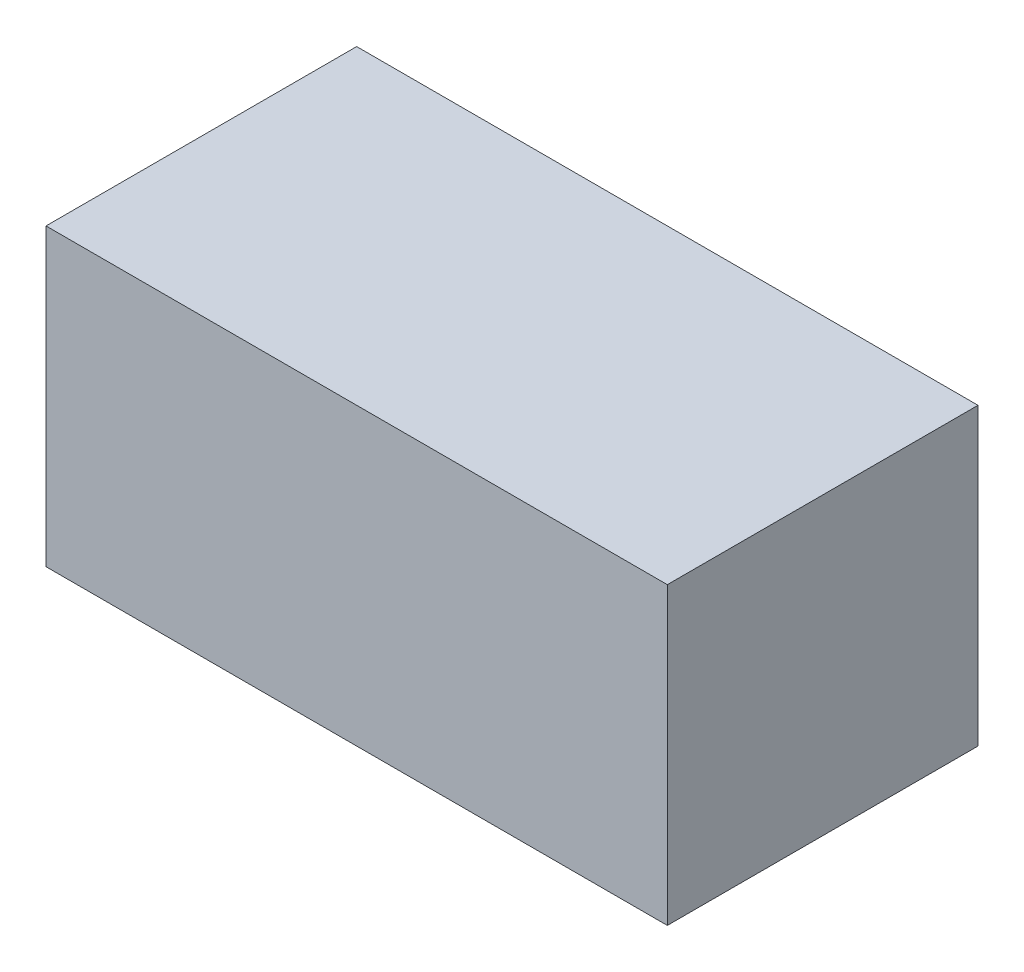
ISO-10303-21;
HEADER;
FILE_DESCRIPTION(('STEP AP214'),'2;1');
FILE_NAME('part.step','',(''),(''),'','','');
FILE_SCHEMA(('AUTOMOTIVE_DESIGN { 1 0 10303 214 1 1 1 1 }'));
ENDSEC;
DATA;
#1=APPLICATION_CONTEXT('core data for automotive mechanical design processes');
#2=APPLICATION_PROTOCOL_DEFINITION('international standard','automotive_design',2000,#1);
#3=PRODUCT_CONTEXT('',#1,'mechanical');
#4=PRODUCT('Part','Part','',(#3));
#5=PRODUCT_RELATED_PRODUCT_CATEGORY('part','',(#4));
#6=PRODUCT_DEFINITION_FORMATION('','',#4);
#7=PRODUCT_DEFINITION_CONTEXT('part definition',#1,'design');
#8=PRODUCT_DEFINITION('design','',#6,#7);
#9=PRODUCT_DEFINITION_SHAPE('','',#8);
#10=(LENGTH_UNIT() NAMED_UNIT(*) SI_UNIT(.MILLI.,.METRE.));
#11=(NAMED_UNIT(*) PLANE_ANGLE_UNIT() SI_UNIT($,.RADIAN.));
#12=(NAMED_UNIT(*) SI_UNIT($,.STERADIAN.) SOLID_ANGLE_UNIT());
#13=UNCERTAINTY_MEASURE_WITH_UNIT(LENGTH_MEASURE(1.E-05),#10,'distance_accuracy_value','');
#14=(GEOMETRIC_REPRESENTATION_CONTEXT(3) GLOBAL_UNCERTAINTY_ASSIGNED_CONTEXT((#13)) GLOBAL_UNIT_ASSIGNED_CONTEXT((#10,
#11,#12)) REPRESENTATION_CONTEXT('',''));
#15=CARTESIAN_POINT('',(0.,0.,0.));
#16=DIRECTION('',(0.,0.,1.));
#17=DIRECTION('',(1.,0.,0.));
#18=AXIS2_PLACEMENT_3D('',#15,#16,#17);
#19=CARTESIAN_POINT('',(0.,19.,0.));
#20=DIRECTION('',(1.,0.,0.));
#21=DIRECTION('',(0.,0.,-1.));
#22=AXIS2_PLACEMENT_3D('',#19,#20,#21);
#23=PLANE('',#22);
#24=DIRECTION('',(0.,0.,1.));
#25=VECTOR('',#24,1.);
#26=CARTESIAN_POINT('',(0.,0.,0.));
#27=LINE('',#26,#25);
#28=CARTESIAN_POINT('',(0.,0.,-20.));
#29=VERTEX_POINT('',#28);
#30=CARTESIAN_POINT('',(0.,0.,0.));
#31=VERTEX_POINT('',#30);
#32=EDGE_CURVE('E105',#29,#31,#27,.T.);
#33=ORIENTED_EDGE('',*,*,#32,.T.);
#34=DIRECTION('',(0.,-1.,0.));
#35=VECTOR('',#34,1.);
#36=CARTESIAN_POINT('',(0.,19.,0.));
#37=LINE('',#36,#35);
#38=CARTESIAN_POINT('',(0.,19.,0.));
#39=VERTEX_POINT('',#38);
#40=EDGE_CURVE('E11',#39,#31,#37,.T.);
#41=ORIENTED_EDGE('',*,*,#40,.F.);
#42=DIRECTION('',(0.,0.,1.));
#43=VECTOR('',#42,1.);
#44=CARTESIAN_POINT('',(0.,19.,0.));
#45=LINE('',#44,#43);
#46=CARTESIAN_POINT('',(0.,19.,-20.));
#47=VERTEX_POINT('',#46);
#48=EDGE_CURVE('E89',#47,#39,#45,.T.);
#49=ORIENTED_EDGE('',*,*,#48,.F.);
#50=DIRECTION('',(0.,-1.,0.));
#51=VECTOR('',#50,1.);
#52=CARTESIAN_POINT('',(0.,19.,-20.));
#53=LINE('',#52,#51);
#54=EDGE_CURVE('E97',#47,#29,#53,.T.);
#55=ORIENTED_EDGE('',*,*,#54,.T.);
#56=EDGE_LOOP('',(#33,#41,#49,#55));
#57=FACE_BOUND('',#56,.T.);
#58=ADVANCED_FACE('F39',(#57),#23,.F.);
#59=CARTESIAN_POINT('',(0.,19.,0.));
#60=DIRECTION('',(0.,0.,-1.));
#61=DIRECTION('',(-1.,0.,0.));
#62=AXIS2_PLACEMENT_3D('',#59,#60,#61);
#63=PLANE('',#62);
#64=DIRECTION('',(1.,0.,0.));
#65=VECTOR('',#64,1.);
#66=CARTESIAN_POINT('',(0.,0.,0.));
#67=LINE('',#66,#65);
#68=CARTESIAN_POINT('',(40.,0.,0.));
#69=VERTEX_POINT('',#68);
#70=EDGE_CURVE('E92',#31,#69,#67,.T.);
#71=ORIENTED_EDGE('',*,*,#70,.T.);
#72=DIRECTION('',(0.,-1.,0.));
#73=VECTOR('',#72,1.);
#74=CARTESIAN_POINT('',(40.,19.,0.));
#75=LINE('',#74,#73);
#76=CARTESIAN_POINT('',(40.,19.,0.));
#77=VERTEX_POINT('',#76);
#78=EDGE_CURVE('E50',#77,#69,#75,.T.);
#79=ORIENTED_EDGE('',*,*,#78,.F.);
#80=DIRECTION('',(1.,0.,0.));
#81=VECTOR('',#80,1.);
#82=CARTESIAN_POINT('',(0.,19.,0.));
#83=LINE('',#82,#81);
#84=EDGE_CURVE('E82',#39,#77,#83,.T.);
#85=ORIENTED_EDGE('',*,*,#84,.F.);
#86=ORIENTED_EDGE('',*,*,#40,.T.);
#87=EDGE_LOOP('',(#71,#79,#85,#86));
#88=FACE_BOUND('',#87,.T.);
#89=ADVANCED_FACE('F93',(#88),#63,.F.);
#90=CARTESIAN_POINT('',(40.,19.,0.));
#91=DIRECTION('',(-1.,0.,0.));
#92=DIRECTION('',(0.,0.,1.));
#93=AXIS2_PLACEMENT_3D('',#90,#91,#92);
#94=PLANE('',#93);
#95=DIRECTION('',(0.,0.,-1.));
#96=VECTOR('',#95,1.);
#97=CARTESIAN_POINT('',(40.,0.,0.));
#98=LINE('',#97,#96);
#99=CARTESIAN_POINT('',(40.,0.,-20.));
#100=VERTEX_POINT('',#99);
#101=EDGE_CURVE('E72',#69,#100,#98,.T.);
#102=ORIENTED_EDGE('',*,*,#101,.T.);
#103=DIRECTION('',(0.,-1.,0.));
#104=VECTOR('',#103,1.);
#105=CARTESIAN_POINT('',(40.,19.,-20.));
#106=LINE('',#105,#104);
#107=CARTESIAN_POINT('',(40.,19.,-20.));
#108=VERTEX_POINT('',#107);
#109=EDGE_CURVE('E94',#108,#100,#106,.T.);
#110=ORIENTED_EDGE('',*,*,#109,.F.);
#111=DIRECTION('',(0.,0.,-1.));
#112=VECTOR('',#111,1.);
#113=CARTESIAN_POINT('',(40.,19.,0.));
#114=LINE('',#113,#112);
#115=EDGE_CURVE('E88',#77,#108,#114,.T.);
#116=ORIENTED_EDGE('',*,*,#115,.F.);
#117=ORIENTED_EDGE('',*,*,#78,.T.);
#118=EDGE_LOOP('',(#102,#110,#116,#117));
#119=FACE_BOUND('',#118,.T.);
#120=ADVANCED_FACE('F96',(#119),#94,.F.);
#121=CARTESIAN_POINT('',(0.,19.,-20.));
#122=DIRECTION('',(0.,0.,1.));
#123=DIRECTION('',(1.,0.,0.));
#124=AXIS2_PLACEMENT_3D('',#121,#122,#123);
#125=PLANE('',#124);
#126=DIRECTION('',(-1.,0.,0.));
#127=VECTOR('',#126,1.);
#128=CARTESIAN_POINT('',(0.,0.,-20.));
#129=LINE('',#128,#127);
#130=EDGE_CURVE('E76',#100,#29,#129,.T.);
#131=ORIENTED_EDGE('',*,*,#130,.T.);
#132=ORIENTED_EDGE('',*,*,#54,.F.);
#133=DIRECTION('',(-1.,0.,0.));
#134=VECTOR('',#133,1.);
#135=CARTESIAN_POINT('',(0.,19.,-20.));
#136=LINE('',#135,#134);
#137=EDGE_CURVE('E54',#108,#47,#136,.T.);
#138=ORIENTED_EDGE('',*,*,#137,.F.);
#139=ORIENTED_EDGE('',*,*,#109,.T.);
#140=EDGE_LOOP('',(#131,#132,#138,#139));
#141=FACE_BOUND('',#140,.T.);
#142=ADVANCED_FACE('F108',(#141),#125,.F.);
#143=CARTESIAN_POINT('',(0.,19.,0.));
#144=DIRECTION('',(0.,-1.,0.));
#145=DIRECTION('',(0.,0.,-1.));
#146=AXIS2_PLACEMENT_3D('',#143,#144,#145);
#147=PLANE('',#146);
#148=ORIENTED_EDGE('',*,*,#48,.T.);
#149=ORIENTED_EDGE('',*,*,#84,.T.);
#150=ORIENTED_EDGE('',*,*,#115,.T.);
#151=ORIENTED_EDGE('',*,*,#137,.T.);
#152=EDGE_LOOP('',(#148,#149,#150,#151));
#153=FACE_BOUND('',#152,.T.);
#154=ADVANCED_FACE('F86',(#153),#147,.F.);
#155=CARTESIAN_POINT('',(0.,0.,0.));
#156=DIRECTION('',(0.,-1.,0.));
#157=DIRECTION('',(0.,0.,-1.));
#158=AXIS2_PLACEMENT_3D('',#155,#156,#157);
#159=PLANE('',#158);
#160=ORIENTED_EDGE('',*,*,#32,.F.);
#161=ORIENTED_EDGE('',*,*,#130,.F.);
#162=ORIENTED_EDGE('',*,*,#101,.F.);
#163=ORIENTED_EDGE('',*,*,#70,.F.);
#164=EDGE_LOOP('',(#160,#161,#162,#163));
#165=FACE_BOUND('',#164,.T.);
#166=ADVANCED_FACE('F115',(#165),#159,.T.);
#167=CLOSED_SHELL('',(#58,#89,#120,#142,#154,#166));
#168=MANIFOLD_SOLID_BREP('B2',#167);
#169=ADVANCED_BREP_SHAPE_REPRESENTATION('',(#18,#168),#14);
#170=SHAPE_DEFINITION_REPRESENTATION(#9,#169);
ENDSEC;
END-ISO-10303-21;
